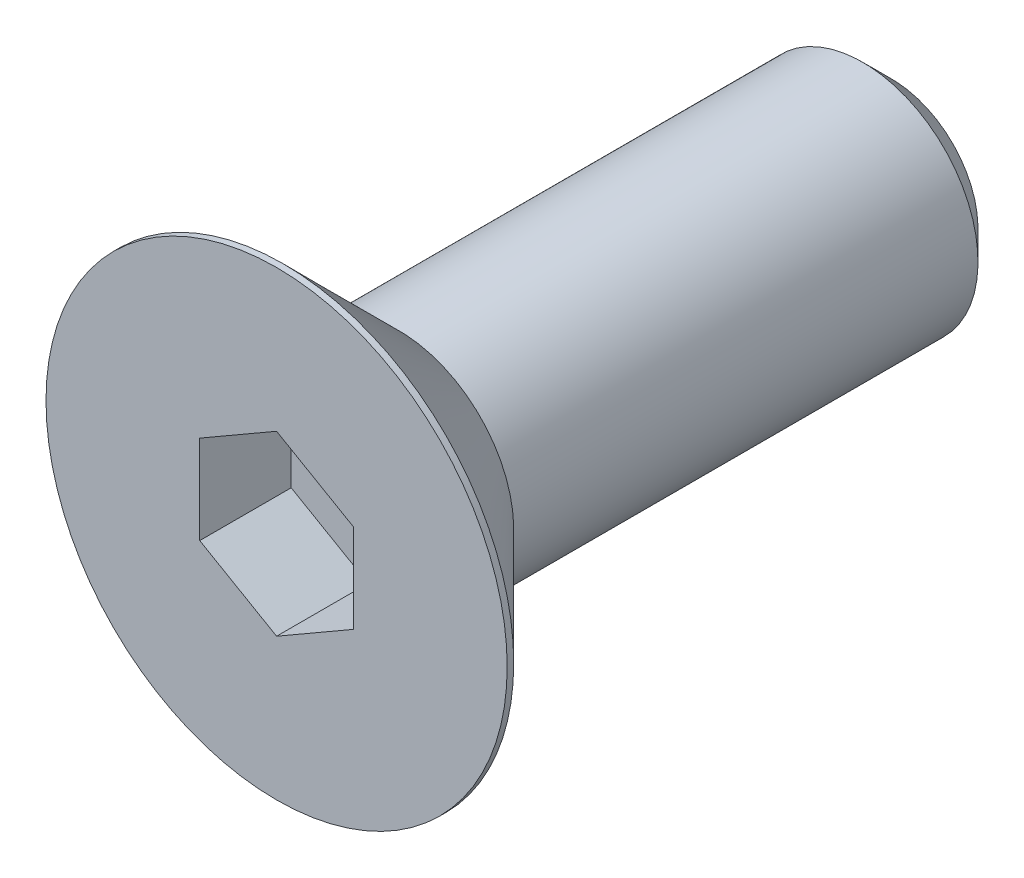
ISO-10303-21;
HEADER;
FILE_DESCRIPTION(('STEP AP214'),'2;1');
FILE_NAME('part.step','',(''),(''),'','','');
FILE_SCHEMA(('AUTOMOTIVE_DESIGN { 1 0 10303 214 1 1 1 1 }'));
ENDSEC;
DATA;
#1=APPLICATION_CONTEXT('core data for automotive mechanical design processes');
#2=APPLICATION_PROTOCOL_DEFINITION('international standard','automotive_design',2000,#1);
#3=PRODUCT_CONTEXT('',#1,'mechanical');
#4=PRODUCT('Part','Part','',(#3));
#5=PRODUCT_RELATED_PRODUCT_CATEGORY('part','',(#4));
#6=PRODUCT_DEFINITION_FORMATION('','',#4);
#7=PRODUCT_DEFINITION_CONTEXT('part definition',#1,'design');
#8=PRODUCT_DEFINITION('design','',#6,#7);
#9=PRODUCT_DEFINITION_SHAPE('','',#8);
#10=(LENGTH_UNIT() NAMED_UNIT(*) SI_UNIT(.MILLI.,.METRE.));
#11=(NAMED_UNIT(*) PLANE_ANGLE_UNIT() SI_UNIT($,.RADIAN.));
#12=(NAMED_UNIT(*) SI_UNIT($,.STERADIAN.) SOLID_ANGLE_UNIT());
#13=UNCERTAINTY_MEASURE_WITH_UNIT(LENGTH_MEASURE(1.E-05),#10,'distance_accuracy_value','');
#14=(GEOMETRIC_REPRESENTATION_CONTEXT(3) GLOBAL_UNCERTAINTY_ASSIGNED_CONTEXT((#13)) GLOBAL_UNIT_ASSIGNED_CONTEXT((#10,
#11,#12)) REPRESENTATION_CONTEXT('',''));
#15=CARTESIAN_POINT('',(0.,0.,0.));
#16=DIRECTION('',(0.,0.,1.));
#17=DIRECTION('',(1.,0.,0.));
#18=AXIS2_PLACEMENT_3D('',#15,#16,#17);
#19=CARTESIAN_POINT('',(0.,0.,3.915));
#20=DIRECTION('',(0.,0.,1.));
#21=DIRECTION('',(0.,-1.,0.));
#22=AXIS2_PLACEMENT_3D('',#19,#20,#21);
#23=CONICAL_SURFACE('',#22,3.,0.785398163397448);
#24=CARTESIAN_POINT('',(0.,0.,2.3));
#25=DIRECTION('',(0.,0.,1.));
#26=DIRECTION('',(0.,-1.,0.));
#27=AXIS2_PLACEMENT_3D('',#24,#25,#26);
#28=CIRCLE('',#27,1.385);
#29=CARTESIAN_POINT('',(0.,-1.385,2.3));
#30=VERTEX_POINT('',#29);
#31=EDGE_CURVE('E150',#30,#30,#28,.T.);
#32=ORIENTED_EDGE('',*,*,#31,.T.);
#33=EDGE_LOOP('',(#32));
#34=FACE_BOUND('',#33,.T.);
#35=CARTESIAN_POINT('',(0.,0.,3.915));
#36=DIRECTION('',(0.,0.,1.));
#37=DIRECTION('',(0.,-1.,0.));
#38=AXIS2_PLACEMENT_3D('',#35,#36,#37);
#39=CIRCLE('',#38,3.);
#40=CARTESIAN_POINT('',(0.,-3.,3.915));
#41=VERTEX_POINT('',#40);
#42=EDGE_CURVE('E12',#41,#41,#39,.T.);
#43=ORIENTED_EDGE('',*,*,#42,.F.);
#44=EDGE_LOOP('',(#43));
#45=FACE_BOUND('',#44,.T.);
#46=ADVANCED_FACE('F49',(#34,#45),#23,.T.);
#47=CARTESIAN_POINT('',(0.,0.,4.));
#48=DIRECTION('',(0.,0.,1.));
#49=DIRECTION('',(0.,-1.,0.));
#50=AXIS2_PLACEMENT_3D('',#47,#48,#49);
#51=CYLINDRICAL_SURFACE('',#50,3.);
#52=ORIENTED_EDGE('',*,*,#42,.T.);
#53=EDGE_LOOP('',(#52));
#54=FACE_BOUND('',#53,.T.);
#55=CARTESIAN_POINT('',(0.,0.,4.));
#56=DIRECTION('',(0.,0.,1.));
#57=DIRECTION('',(0.,-1.,0.));
#58=AXIS2_PLACEMENT_3D('',#55,#56,#57);
#59=CIRCLE('',#58,3.);
#60=CARTESIAN_POINT('',(0.,-3.,4.));
#61=VERTEX_POINT('',#60);
#62=EDGE_CURVE('E56',#61,#61,#59,.T.);
#63=ORIENTED_EDGE('',*,*,#62,.F.);
#64=EDGE_LOOP('',(#63));
#65=FACE_BOUND('',#64,.T.);
#66=ADVANCED_FACE('F162',(#54,#65),#51,.T.);
#67=CARTESIAN_POINT('',(0.,0.,4.));
#68=DIRECTION('',(0.,0.,-1.));
#69=DIRECTION('',(0.,1.,0.));
#70=AXIS2_PLACEMENT_3D('',#67,#68,#69);
#71=PLANE('',#70);
#72=DIRECTION('',(0.,1.,0.));
#73=VECTOR('',#72,1.);
#74=CARTESIAN_POINT('',(1.,-0.577350269189628,4.));
#75=LINE('',#74,#73);
#76=CARTESIAN_POINT('',(1.,-0.577350269189628,4.));
#77=VERTEX_POINT('',#76);
#78=CARTESIAN_POINT('',(1.,0.577350269189625,4.));
#79=VERTEX_POINT('',#78);
#80=EDGE_CURVE('E137',#77,#79,#75,.T.);
#81=ORIENTED_EDGE('',*,*,#80,.F.);
#82=DIRECTION('',(0.866025403784438,0.5,0.));
#83=VECTOR('',#82,1.);
#84=CARTESIAN_POINT('',(0.,-1.15470053837926,4.));
#85=LINE('',#84,#83);
#86=CARTESIAN_POINT('',(0.,-1.15470053837926,4.));
#87=VERTEX_POINT('',#86);
#88=EDGE_CURVE('E63',#87,#77,#85,.T.);
#89=ORIENTED_EDGE('',*,*,#88,.F.);
#90=DIRECTION('',(0.866025403784439,-0.5,0.));
#91=VECTOR('',#90,1.);
#92=CARTESIAN_POINT('',(-1.,-0.577350269189629,4.));
#93=LINE('',#92,#91);
#94=CARTESIAN_POINT('',(-1.,-0.577350269189629,4.));
#95=VERTEX_POINT('',#94);
#96=EDGE_CURVE('E146',#95,#87,#93,.T.);
#97=ORIENTED_EDGE('',*,*,#96,.F.);
#98=DIRECTION('',(0.,-1.,0.));
#99=VECTOR('',#98,1.);
#100=CARTESIAN_POINT('',(-1.,0.577350269189625,4.));
#101=LINE('',#100,#99);
#102=CARTESIAN_POINT('',(-1.,0.577350269189625,4.));
#103=VERTEX_POINT('',#102);
#104=EDGE_CURVE('E144',#103,#95,#101,.T.);
#105=ORIENTED_EDGE('',*,*,#104,.F.);
#106=DIRECTION('',(-0.866025403784439,-0.5,0.));
#107=VECTOR('',#106,1.);
#108=CARTESIAN_POINT('',(0.,1.15470053837925,4.));
#109=LINE('',#108,#107);
#110=CARTESIAN_POINT('',(0.,1.15470053837925,4.));
#111=VERTEX_POINT('',#110);
#112=EDGE_CURVE('E111',#111,#103,#109,.T.);
#113=ORIENTED_EDGE('',*,*,#112,.F.);
#114=DIRECTION('',(-0.866025403784439,0.5,0.));
#115=VECTOR('',#114,1.);
#116=CARTESIAN_POINT('',(1.,0.577350269189625,4.));
#117=LINE('',#116,#115);
#118=EDGE_CURVE('E140',#79,#111,#117,.T.);
#119=ORIENTED_EDGE('',*,*,#118,.F.);
#120=EDGE_LOOP('',(#81,#89,#97,#105,#113,#119));
#121=FACE_BOUND('',#120,.T.);
#122=ORIENTED_EDGE('',*,*,#62,.T.);
#123=EDGE_LOOP('',(#122));
#124=FACE_BOUND('',#123,.T.);
#125=ADVANCED_FACE('F160',(#121,#124),#71,.F.);
#126=CARTESIAN_POINT('',(0.,0.,2.3));
#127=DIRECTION('',(0.,0.,-1.));
#128=DIRECTION('',(0.,1.,0.));
#129=AXIS2_PLACEMENT_3D('',#126,#127,#128);
#130=PLANE('',#129);
#131=ORIENTED_EDGE('',*,*,#31,.F.);
#132=EDGE_LOOP('',(#131));
#133=FACE_BOUND('',#132,.T.);
#134=ADVANCED_FACE('F169',(#133),#130,.T.);
#135=CARTESIAN_POINT('',(0.,-1.15470053837926,2.81));
#136=DIRECTION('',(0.5,-0.866025403784439,0.));
#137=DIRECTION('',(0.866025403784439,0.5,0.));
#138=AXIS2_PLACEMENT_3D('',#135,#136,#137);
#139=PLANE('',#138);
#140=ORIENTED_EDGE('',*,*,#88,.T.);
#141=DIRECTION('',(0.,0.,1.));
#142=VECTOR('',#141,1.);
#143=CARTESIAN_POINT('',(1.,-0.577350269189628,2.81));
#144=LINE('',#143,#142);
#145=CARTESIAN_POINT('',(1.,-0.577350269189628,2.81));
#146=VERTEX_POINT('',#145);
#147=EDGE_CURVE('E93',#146,#77,#144,.T.);
#148=ORIENTED_EDGE('',*,*,#147,.F.);
#149=DIRECTION('',(0.866025403784438,0.5,0.));
#150=VECTOR('',#149,1.);
#151=CARTESIAN_POINT('',(0.,-1.15470053837926,2.81));
#152=LINE('',#151,#150);
#153=CARTESIAN_POINT('',(0.,-1.15470053837926,2.81));
#154=VERTEX_POINT('',#153);
#155=EDGE_CURVE('E148',#154,#146,#152,.T.);
#156=ORIENTED_EDGE('',*,*,#155,.F.);
#157=DIRECTION('',(0.,0.,1.));
#158=VECTOR('',#157,1.);
#159=CARTESIAN_POINT('',(0.,-1.15470053837926,2.81));
#160=LINE('',#159,#158);
#161=EDGE_CURVE('E71',#154,#87,#160,.T.);
#162=ORIENTED_EDGE('',*,*,#161,.T.);
#163=EDGE_LOOP('',(#140,#148,#156,#162));
#164=FACE_BOUND('',#163,.T.);
#165=ADVANCED_FACE('F176',(#164),#139,.F.);
#166=CARTESIAN_POINT('',(-1.,-0.577350269189629,2.81));
#167=DIRECTION('',(-0.5,-0.866025403784439,0.));
#168=DIRECTION('',(0.866025403784439,-0.5,0.));
#169=AXIS2_PLACEMENT_3D('',#166,#167,#168);
#170=PLANE('',#169);
#171=ORIENTED_EDGE('',*,*,#96,.T.);
#172=ORIENTED_EDGE('',*,*,#161,.F.);
#173=DIRECTION('',(0.866025403784439,-0.5,0.));
#174=VECTOR('',#173,1.);
#175=CARTESIAN_POINT('',(-1.,-0.577350269189629,2.81));
#176=LINE('',#175,#174);
#177=CARTESIAN_POINT('',(-1.,-0.577350269189629,2.81));
#178=VERTEX_POINT('',#177);
#179=EDGE_CURVE('E123',#178,#154,#176,.T.);
#180=ORIENTED_EDGE('',*,*,#179,.F.);
#181=DIRECTION('',(0.,0.,1.));
#182=VECTOR('',#181,1.);
#183=CARTESIAN_POINT('',(-1.,-0.577350269189629,2.81));
#184=LINE('',#183,#182);
#185=EDGE_CURVE('E115',#178,#95,#184,.T.);
#186=ORIENTED_EDGE('',*,*,#185,.T.);
#187=EDGE_LOOP('',(#171,#172,#180,#186));
#188=FACE_BOUND('',#187,.T.);
#189=ADVANCED_FACE('F180',(#188),#170,.F.);
#190=CARTESIAN_POINT('',(-1.,0.577350269189625,2.81));
#191=DIRECTION('',(-1.,0.,0.));
#192=DIRECTION('',(0.,-1.,0.));
#193=AXIS2_PLACEMENT_3D('',#190,#191,#192);
#194=PLANE('',#193);
#195=ORIENTED_EDGE('',*,*,#104,.T.);
#196=ORIENTED_EDGE('',*,*,#185,.F.);
#197=DIRECTION('',(0.,-1.,0.));
#198=VECTOR('',#197,1.);
#199=CARTESIAN_POINT('',(-1.,0.577350269189625,2.81));
#200=LINE('',#199,#198);
#201=CARTESIAN_POINT('',(-1.,0.577350269189625,2.81));
#202=VERTEX_POINT('',#201);
#203=EDGE_CURVE('E119',#202,#178,#200,.T.);
#204=ORIENTED_EDGE('',*,*,#203,.F.);
#205=DIRECTION('',(0.,0.,1.));
#206=VECTOR('',#205,1.);
#207=CARTESIAN_POINT('',(-1.,0.577350269189625,2.81));
#208=LINE('',#207,#206);
#209=EDGE_CURVE('E104',#202,#103,#208,.T.);
#210=ORIENTED_EDGE('',*,*,#209,.T.);
#211=EDGE_LOOP('',(#195,#196,#204,#210));
#212=FACE_BOUND('',#211,.T.);
#213=ADVANCED_FACE('F120',(#212),#194,.F.);
#214=CARTESIAN_POINT('',(0.,1.15470053837925,2.81));
#215=DIRECTION('',(-0.5,0.866025403784439,0.));
#216=DIRECTION('',(-0.866025403784439,-0.5,0.));
#217=AXIS2_PLACEMENT_3D('',#214,#215,#216);
#218=PLANE('',#217);
#219=ORIENTED_EDGE('',*,*,#112,.T.);
#220=ORIENTED_EDGE('',*,*,#209,.F.);
#221=DIRECTION('',(-0.866025403784439,-0.5,0.));
#222=VECTOR('',#221,1.);
#223=CARTESIAN_POINT('',(0.,1.15470053837925,2.81));
#224=LINE('',#223,#222);
#225=CARTESIAN_POINT('',(0.,1.15470053837925,2.81));
#226=VERTEX_POINT('',#225);
#227=EDGE_CURVE('E108',#226,#202,#224,.T.);
#228=ORIENTED_EDGE('',*,*,#227,.F.);
#229=DIRECTION('',(0.,0.,1.));
#230=VECTOR('',#229,1.);
#231=CARTESIAN_POINT('',(0.,1.15470053837925,2.81));
#232=LINE('',#231,#230);
#233=EDGE_CURVE('E116',#226,#111,#232,.T.);
#234=ORIENTED_EDGE('',*,*,#233,.T.);
#235=EDGE_LOOP('',(#219,#220,#228,#234));
#236=FACE_BOUND('',#235,.T.);
#237=ADVANCED_FACE('F106',(#236),#218,.F.);
#238=CARTESIAN_POINT('',(1.,0.577350269189625,2.81));
#239=DIRECTION('',(0.5,0.866025403784439,0.));
#240=DIRECTION('',(-0.866025403784439,0.5,0.));
#241=AXIS2_PLACEMENT_3D('',#238,#239,#240);
#242=PLANE('',#241);
#243=ORIENTED_EDGE('',*,*,#118,.T.);
#244=ORIENTED_EDGE('',*,*,#233,.F.);
#245=DIRECTION('',(-0.866025403784439,0.5,0.));
#246=VECTOR('',#245,1.);
#247=CARTESIAN_POINT('',(1.,0.577350269189625,2.81));
#248=LINE('',#247,#246);
#249=CARTESIAN_POINT('',(1.,0.577350269189625,2.81));
#250=VERTEX_POINT('',#249);
#251=EDGE_CURVE('E129',#250,#226,#248,.T.);
#252=ORIENTED_EDGE('',*,*,#251,.F.);
#253=DIRECTION('',(0.,0.,1.));
#254=VECTOR('',#253,1.);
#255=CARTESIAN_POINT('',(1.,0.577350269189625,2.81));
#256=LINE('',#255,#254);
#257=EDGE_CURVE('E153',#250,#79,#256,.T.);
#258=ORIENTED_EDGE('',*,*,#257,.T.);
#259=EDGE_LOOP('',(#243,#244,#252,#258));
#260=FACE_BOUND('',#259,.T.);
#261=ADVANCED_FACE('F184',(#260),#242,.F.);
#262=CARTESIAN_POINT('',(1.,-0.577350269189628,2.81));
#263=DIRECTION('',(1.,0.,0.));
#264=DIRECTION('',(0.,1.,0.));
#265=AXIS2_PLACEMENT_3D('',#262,#263,#264);
#266=PLANE('',#265);
#267=ORIENTED_EDGE('',*,*,#80,.T.);
#268=ORIENTED_EDGE('',*,*,#257,.F.);
#269=DIRECTION('',(0.,1.,0.));
#270=VECTOR('',#269,1.);
#271=CARTESIAN_POINT('',(1.,-0.577350269189628,2.81));
#272=LINE('',#271,#270);
#273=EDGE_CURVE('E131',#146,#250,#272,.T.);
#274=ORIENTED_EDGE('',*,*,#273,.F.);
#275=ORIENTED_EDGE('',*,*,#147,.T.);
#276=EDGE_LOOP('',(#267,#268,#274,#275));
#277=FACE_BOUND('',#276,.T.);
#278=ADVANCED_FACE('F181',(#277),#266,.F.);
#279=CARTESIAN_POINT('',(1.,-0.577350269189628,2.81));
#280=DIRECTION('',(0.,0.,1.));
#281=DIRECTION('',(1.,0.,0.));
#282=AXIS2_PLACEMENT_3D('',#279,#280,#281);
#283=PLANE('',#282);
#284=ORIENTED_EDGE('',*,*,#155,.T.);
#285=ORIENTED_EDGE('',*,*,#273,.T.);
#286=ORIENTED_EDGE('',*,*,#251,.T.);
#287=ORIENTED_EDGE('',*,*,#227,.T.);
#288=ORIENTED_EDGE('',*,*,#203,.T.);
#289=ORIENTED_EDGE('',*,*,#179,.T.);
#290=EDGE_LOOP('',(#284,#285,#286,#287,#288,#289));
#291=FACE_BOUND('',#290,.T.);
#292=ADVANCED_FACE('F126',(#291),#283,.T.);
#293=CLOSED_SHELL('',(#46,#66,#125,#134,#165,#189,#213,#237,#261,#278,#292));
#294=MANIFOLD_SOLID_BREP('B2',#293);
#295=CARTESIAN_POINT('',(0.,-1.50000000000001,2.81000000000001));
#296=DIRECTION('',(0.,0.,-1.));
#297=DIRECTION('',(0.,1.,0.));
#298=AXIS2_PLACEMENT_3D('',#295,#296,#297);
#299=PLANE('',#298);
#300=CARTESIAN_POINT('',(0.,0.,2.81000000000001));
#301=DIRECTION('',(0.,0.,1.));
#302=DIRECTION('',(0.,-1.,0.));
#303=AXIS2_PLACEMENT_3D('',#300,#301,#302);
#304=CIRCLE('',#303,1.50000000000001);
#305=CARTESIAN_POINT('',(0.,-1.50000000000001,2.81000000000001));
#306=VERTEX_POINT('',#305);
#307=EDGE_CURVE('E283',#306,#306,#304,.T.);
#308=ORIENTED_EDGE('',*,*,#307,.T.);
#309=EDGE_LOOP('',(#308));
#310=FACE_BOUND('',#309,.T.);
#311=ADVANCED_FACE('F270',(#310),#299,.F.);
#312=CARTESIAN_POINT('',(0.,-1.5,-4.00000000000001));
#313=DIRECTION('',(0.,0.,1.));
#314=DIRECTION('',(0.,-1.,0.));
#315=AXIS2_PLACEMENT_3D('',#312,#313,#314);
#316=PLANE('',#315);
#317=CARTESIAN_POINT('',(0.,0.,-4.00000000000001));
#318=DIRECTION('',(0.,0.,1.));
#319=DIRECTION('',(0.,-1.,0.));
#320=AXIS2_PLACEMENT_3D('',#317,#318,#319);
#321=CIRCLE('',#320,1.125);
#322=CARTESIAN_POINT('',(0.,-1.125,-4.00000000000001));
#323=VERTEX_POINT('',#322);
#324=EDGE_CURVE('E48',#323,#323,#321,.F.);
#325=ORIENTED_EDGE('',*,*,#324,.T.);
#326=EDGE_LOOP('',(#325));
#327=FACE_BOUND('',#326,.T.);
#328=ADVANCED_FACE('F294',(#327),#316,.F.);
#329=CARTESIAN_POINT('',(0.,0.,2.81));
#330=DIRECTION('',(0.,0.,1.));
#331=DIRECTION('',(0.,-1.,0.));
#332=AXIS2_PLACEMENT_3D('',#329,#330,#331);
#333=CYLINDRICAL_SURFACE('',#332,1.50000000000001);
#334=CARTESIAN_POINT('',(0.,0.,-3.625));
#335=DIRECTION('',(0.,0.,1.));
#336=DIRECTION('',(0.,-1.,0.));
#337=AXIS2_PLACEMENT_3D('',#334,#335,#336);
#338=CIRCLE('',#337,1.50000000000001);
#339=CARTESIAN_POINT('',(0.,-1.50000000000001,-3.625));
#340=VERTEX_POINT('',#339);
#341=EDGE_CURVE('E278',#340,#340,#338,.T.);
#342=ORIENTED_EDGE('',*,*,#341,.T.);
#343=EDGE_LOOP('',(#342));
#344=FACE_BOUND('',#343,.T.);
#345=ORIENTED_EDGE('',*,*,#307,.F.);
#346=EDGE_LOOP('',(#345));
#347=FACE_BOUND('',#346,.T.);
#348=ADVANCED_FACE('F292',(#344,#347),#333,.T.);
#349=CARTESIAN_POINT('',(0.,0.,-3.625));
#350=DIRECTION('',(0.,0.,1.));
#351=DIRECTION('',(0.,-1.,0.));
#352=AXIS2_PLACEMENT_3D('',#349,#350,#351);
#353=CONICAL_SURFACE('',#352,1.50000000000001,0.785398163397451);
#354=ORIENTED_EDGE('',*,*,#324,.F.);
#355=EDGE_LOOP('',(#354));
#356=FACE_BOUND('',#355,.T.);
#357=ORIENTED_EDGE('',*,*,#341,.F.);
#358=EDGE_LOOP('',(#357));
#359=FACE_BOUND('',#358,.T.);
#360=ADVANCED_FACE('F272',(#356,#359),#353,.T.);
#361=CLOSED_SHELL('',(#311,#328,#348,#360));
#362=MANIFOLD_SOLID_BREP('B6',#361);
#363=ADVANCED_BREP_SHAPE_REPRESENTATION('',(#18,#294,#362),#14);
#364=SHAPE_DEFINITION_REPRESENTATION(#9,#363);
ENDSEC;
END-ISO-10303-21;
